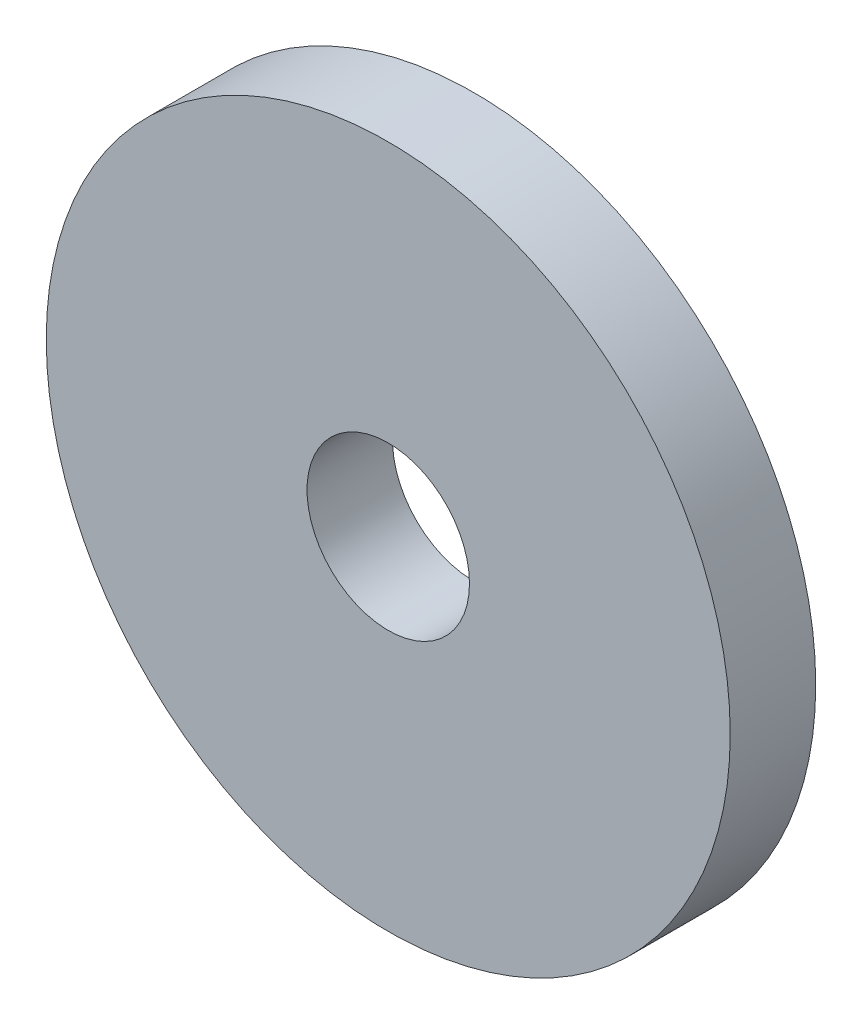
ISO-10303-21;
HEADER;
FILE_DESCRIPTION(('STEP AP214'),'2;1');
FILE_NAME('part.step','',(''),(''),'','','');
FILE_SCHEMA(('AUTOMOTIVE_DESIGN { 1 0 10303 214 1 1 1 1 }'));
ENDSEC;
DATA;
#1=APPLICATION_CONTEXT('core data for automotive mechanical design processes');
#2=APPLICATION_PROTOCOL_DEFINITION('international standard','automotive_design',2000,#1);
#3=PRODUCT_CONTEXT('',#1,'mechanical');
#4=PRODUCT('Part','Part','',(#3));
#5=PRODUCT_RELATED_PRODUCT_CATEGORY('part','',(#4));
#6=PRODUCT_DEFINITION_FORMATION('','',#4);
#7=PRODUCT_DEFINITION_CONTEXT('part definition',#1,'design');
#8=PRODUCT_DEFINITION('design','',#6,#7);
#9=PRODUCT_DEFINITION_SHAPE('','',#8);
#10=(LENGTH_UNIT() NAMED_UNIT(*) SI_UNIT(.MILLI.,.METRE.));
#11=(NAMED_UNIT(*) PLANE_ANGLE_UNIT() SI_UNIT($,.RADIAN.));
#12=(NAMED_UNIT(*) SI_UNIT($,.STERADIAN.) SOLID_ANGLE_UNIT());
#13=UNCERTAINTY_MEASURE_WITH_UNIT(LENGTH_MEASURE(1.E-05),#10,'distance_accuracy_value','');
#14=(GEOMETRIC_REPRESENTATION_CONTEXT(3) GLOBAL_UNCERTAINTY_ASSIGNED_CONTEXT((#13)) GLOBAL_UNIT_ASSIGNED_CONTEXT((#10,
#11,#12)) REPRESENTATION_CONTEXT('',''));
#15=CARTESIAN_POINT('',(0.,0.,0.));
#16=DIRECTION('',(0.,0.,1.));
#17=DIRECTION('',(1.,0.,0.));
#18=AXIS2_PLACEMENT_3D('',#15,#16,#17);
#19=CARTESIAN_POINT('',(150.891565486525,-14.8895121152623,10.));
#20=DIRECTION('',(0.,0.,-1.));
#21=DIRECTION('',(-1.,0.,0.));
#22=AXIS2_PLACEMENT_3D('',#19,#20,#21);
#23=CYLINDRICAL_SURFACE('',#22,40.);
#24=CARTESIAN_POINT('',(150.891565486525,-14.8895121152623,10.));
#25=DIRECTION('',(0.,0.,1.));
#26=DIRECTION('',(1.,0.,0.));
#27=AXIS2_PLACEMENT_3D('',#24,#25,#26);
#28=CIRCLE('',#27,40.);
#29=CARTESIAN_POINT('',(190.891565486526,-14.8895121152623,10.));
#30=VERTEX_POINT('',#29);
#31=EDGE_CURVE('E10',#30,#30,#28,.T.);
#32=ORIENTED_EDGE('',*,*,#31,.F.);
#33=EDGE_LOOP('',(#32));
#34=FACE_BOUND('',#33,.T.);
#35=CARTESIAN_POINT('',(150.891565486525,-14.8895121152623,0.));
#36=DIRECTION('',(0.,0.,1.));
#37=DIRECTION('',(1.,0.,0.));
#38=AXIS2_PLACEMENT_3D('',#35,#36,#37);
#39=CIRCLE('',#38,40.);
#40=CARTESIAN_POINT('',(190.891565486526,-14.8895121152623,0.));
#41=VERTEX_POINT('',#40);
#42=EDGE_CURVE('E36',#41,#41,#39,.T.);
#43=ORIENTED_EDGE('',*,*,#42,.T.);
#44=EDGE_LOOP('',(#43));
#45=FACE_BOUND('',#44,.T.);
#46=ADVANCED_FACE('F33',(#34,#45),#23,.T.);
#47=CARTESIAN_POINT('',(150.891565486525,-14.8895121152623,10.));
#48=DIRECTION('',(0.,0.,1.));
#49=DIRECTION('',(1.,0.,0.));
#50=AXIS2_PLACEMENT_3D('',#47,#48,#49);
#51=PLANE('',#50);
#52=CARTESIAN_POINT('',(150.891565486525,-14.8895121152623,10.));
#53=DIRECTION('',(0.,0.,1.));
#54=DIRECTION('',(1.,0.,0.));
#55=AXIS2_PLACEMENT_3D('',#52,#53,#54);
#56=CIRCLE('',#55,9.50000000000001);
#57=CARTESIAN_POINT('',(160.391565486526,-14.8895121152623,10.));
#58=VERTEX_POINT('',#57);
#59=EDGE_CURVE('E45',#58,#58,#56,.T.);
#60=ORIENTED_EDGE('',*,*,#59,.F.);
#61=EDGE_LOOP('',(#60));
#62=FACE_BOUND('',#61,.T.);
#63=ORIENTED_EDGE('',*,*,#31,.T.);
#64=EDGE_LOOP('',(#63));
#65=FACE_BOUND('',#64,.T.);
#66=ADVANCED_FACE('F60',(#62,#65),#51,.T.);
#67=CARTESIAN_POINT('',(150.891565486525,-14.8895121152623,0.));
#68=DIRECTION('',(0.,0.,1.));
#69=DIRECTION('',(1.,0.,0.));
#70=AXIS2_PLACEMENT_3D('',#67,#68,#69);
#71=PLANE('',#70);
#72=CARTESIAN_POINT('',(150.891565486525,-14.8895121152623,0.));
#73=DIRECTION('',(0.,0.,1.));
#74=DIRECTION('',(1.,0.,0.));
#75=AXIS2_PLACEMENT_3D('',#72,#73,#74);
#76=CIRCLE('',#75,9.50000000000001);
#77=CARTESIAN_POINT('',(160.391565486526,-14.8895121152623,0.));
#78=VERTEX_POINT('',#77);
#79=EDGE_CURVE('E43',#78,#78,#76,.T.);
#80=ORIENTED_EDGE('',*,*,#79,.T.);
#81=EDGE_LOOP('',(#80));
#82=FACE_BOUND('',#81,.T.);
#83=ORIENTED_EDGE('',*,*,#42,.F.);
#84=EDGE_LOOP('',(#83));
#85=FACE_BOUND('',#84,.T.);
#86=ADVANCED_FACE('F51',(#82,#85),#71,.F.);
#87=CARTESIAN_POINT('',(150.891565486525,-14.8895121152623,0.));
#88=DIRECTION('',(0.,0.,1.));
#89=DIRECTION('',(1.,0.,0.));
#90=AXIS2_PLACEMENT_3D('',#87,#88,#89);
#91=CYLINDRICAL_SURFACE('',#90,9.50000000000001);
#92=ORIENTED_EDGE('',*,*,#79,.F.);
#93=EDGE_LOOP('',(#92));
#94=FACE_BOUND('',#93,.T.);
#95=ORIENTED_EDGE('',*,*,#59,.T.);
#96=EDGE_LOOP('',(#95));
#97=FACE_BOUND('',#96,.T.);
#98=ADVANCED_FACE('F54',(#94,#97),#91,.F.);
#99=CLOSED_SHELL('',(#46,#66,#86,#98));
#100=MANIFOLD_SOLID_BREP('B2',#99);
#101=ADVANCED_BREP_SHAPE_REPRESENTATION('',(#18,#100),#14);
#102=SHAPE_DEFINITION_REPRESENTATION(#9,#101);
ENDSEC;
END-ISO-10303-21;
